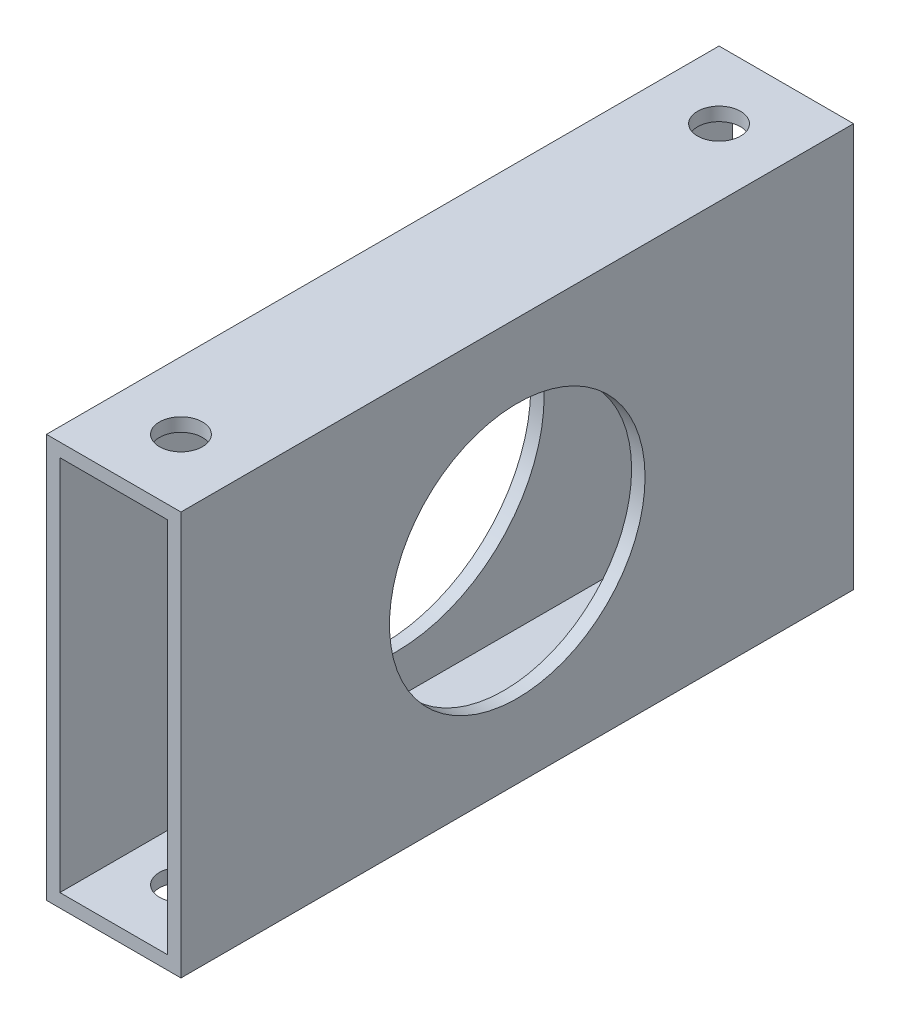
ISO-10303-21;
HEADER;
FILE_DESCRIPTION(('STEP AP214'),'2;1');
FILE_NAME('part.step','',(''),(''),'','','');
FILE_SCHEMA(('AUTOMOTIVE_DESIGN { 1 0 10303 214 1 1 1 1 }'));
ENDSEC;
DATA;
#1=APPLICATION_CONTEXT('core data for automotive mechanical design processes');
#2=APPLICATION_PROTOCOL_DEFINITION('international standard','automotive_design',2000,#1);
#3=PRODUCT_CONTEXT('',#1,'mechanical');
#4=PRODUCT('Part','Part','',(#3));
#5=PRODUCT_RELATED_PRODUCT_CATEGORY('part','',(#4));
#6=PRODUCT_DEFINITION_FORMATION('','',#4);
#7=PRODUCT_DEFINITION_CONTEXT('part definition',#1,'design');
#8=PRODUCT_DEFINITION('design','',#6,#7);
#9=PRODUCT_DEFINITION_SHAPE('','',#8);
#10=(LENGTH_UNIT() NAMED_UNIT(*) SI_UNIT(.MILLI.,.METRE.));
#11=(NAMED_UNIT(*) PLANE_ANGLE_UNIT() SI_UNIT($,.RADIAN.));
#12=(NAMED_UNIT(*) SI_UNIT($,.STERADIAN.) SOLID_ANGLE_UNIT());
#13=UNCERTAINTY_MEASURE_WITH_UNIT(LENGTH_MEASURE(1.E-05),#10,'distance_accuracy_value','');
#14=(GEOMETRIC_REPRESENTATION_CONTEXT(3) GLOBAL_UNCERTAINTY_ASSIGNED_CONTEXT((#13)) GLOBAL_UNIT_ASSIGNED_CONTEXT((#10,
#11,#12)) REPRESENTATION_CONTEXT('',''));
#15=CARTESIAN_POINT('',(0.,0.,0.));
#16=DIRECTION('',(0.,0.,1.));
#17=DIRECTION('',(1.,0.,0.));
#18=AXIS2_PLACEMENT_3D('',#15,#16,#17);
#19=CARTESIAN_POINT('',(0.,0.,50.));
#20=DIRECTION('',(0.,0.,1.));
#21=DIRECTION('',(1.,0.,0.));
#22=AXIS2_PLACEMENT_3D('',#19,#20,#21);
#23=PLANE('',#22);
#24=DIRECTION('',(0.,1.,0.));
#25=VECTOR('',#24,1.);
#26=CARTESIAN_POINT('',(5.,-15.,50.));
#27=LINE('',#26,#25);
#28=CARTESIAN_POINT('',(5.,-15.,50.));
#29=VERTEX_POINT('',#28);
#30=CARTESIAN_POINT('',(5.,15.,50.));
#31=VERTEX_POINT('',#30);
#32=EDGE_CURVE('E164',#29,#31,#27,.T.);
#33=ORIENTED_EDGE('',*,*,#32,.T.);
#34=DIRECTION('',(-1.,0.,0.));
#35=VECTOR('',#34,1.);
#36=CARTESIAN_POINT('',(-5.,15.,50.));
#37=LINE('',#36,#35);
#38=CARTESIAN_POINT('',(-5.,15.,50.));
#39=VERTEX_POINT('',#38);
#40=EDGE_CURVE('E167',#31,#39,#37,.T.);
#41=ORIENTED_EDGE('',*,*,#40,.T.);
#42=DIRECTION('',(0.,-1.,0.));
#43=VECTOR('',#42,1.);
#44=CARTESIAN_POINT('',(-5.,-15.,50.));
#45=LINE('',#44,#43);
#46=CARTESIAN_POINT('',(-5.,-15.,50.));
#47=VERTEX_POINT('',#46);
#48=EDGE_CURVE('E170',#39,#47,#45,.T.);
#49=ORIENTED_EDGE('',*,*,#48,.T.);
#50=DIRECTION('',(1.,0.,0.));
#51=VECTOR('',#50,1.);
#52=CARTESIAN_POINT('',(-5.,-15.,50.));
#53=LINE('',#52,#51);
#54=EDGE_CURVE('E172',#47,#29,#53,.T.);
#55=ORIENTED_EDGE('',*,*,#54,.T.);
#56=EDGE_LOOP('',(#33,#41,#49,#55));
#57=FACE_BOUND('',#56,.T.);
#58=DIRECTION('',(-1.,0.,0.));
#59=VECTOR('',#58,1.);
#60=CARTESIAN_POINT('',(0.,14.,50.));
#61=LINE('',#60,#59);
#62=CARTESIAN_POINT('',(4.,14.,50.));
#63=VERTEX_POINT('',#62);
#64=CARTESIAN_POINT('',(-4.,14.,50.));
#65=VERTEX_POINT('',#64);
#66=EDGE_CURVE('E134',#63,#65,#61,.T.);
#67=ORIENTED_EDGE('',*,*,#66,.F.);
#68=DIRECTION('',(0.,1.,0.));
#69=VECTOR('',#68,1.);
#70=CARTESIAN_POINT('',(4.,0.,50.));
#71=LINE('',#70,#69);
#72=CARTESIAN_POINT('',(4.,-14.,50.));
#73=VERTEX_POINT('',#72);
#74=EDGE_CURVE('E126',#73,#63,#71,.T.);
#75=ORIENTED_EDGE('',*,*,#74,.F.);
#76=DIRECTION('',(1.,0.,0.));
#77=VECTOR('',#76,1.);
#78=CARTESIAN_POINT('',(0.,-14.,50.));
#79=LINE('',#78,#77);
#80=CARTESIAN_POINT('',(-4.,-14.,50.));
#81=VERTEX_POINT('',#80);
#82=EDGE_CURVE('E148',#81,#73,#79,.T.);
#83=ORIENTED_EDGE('',*,*,#82,.F.);
#84=DIRECTION('',(0.,-1.,0.));
#85=VECTOR('',#84,1.);
#86=CARTESIAN_POINT('',(-4.,0.,50.));
#87=LINE('',#86,#85);
#88=EDGE_CURVE('E146',#65,#81,#87,.T.);
#89=ORIENTED_EDGE('',*,*,#88,.F.);
#90=EDGE_LOOP('',(#67,#75,#83,#89));
#91=FACE_BOUND('',#90,.T.);
#92=ADVANCED_FACE('F59',(#57,#91),#23,.T.);
#93=CARTESIAN_POINT('',(0.,0.,0.));
#94=DIRECTION('',(0.,0.,1.));
#95=DIRECTION('',(1.,0.,0.));
#96=AXIS2_PLACEMENT_3D('',#93,#94,#95);
#97=PLANE('',#96);
#98=DIRECTION('',(0.,1.,0.));
#99=VECTOR('',#98,1.);
#100=CARTESIAN_POINT('',(5.,-15.,0.));
#101=LINE('',#100,#99);
#102=CARTESIAN_POINT('',(5.,-15.,0.));
#103=VERTEX_POINT('',#102);
#104=CARTESIAN_POINT('',(5.,15.,0.));
#105=VERTEX_POINT('',#104);
#106=EDGE_CURVE('E142',#103,#105,#101,.T.);
#107=ORIENTED_EDGE('',*,*,#106,.F.);
#108=DIRECTION('',(1.,0.,0.));
#109=VECTOR('',#108,1.);
#110=CARTESIAN_POINT('',(-5.,-15.,0.));
#111=LINE('',#110,#109);
#112=CARTESIAN_POINT('',(-5.,-15.,0.));
#113=VERTEX_POINT('',#112);
#114=EDGE_CURVE('E168',#113,#103,#111,.T.);
#115=ORIENTED_EDGE('',*,*,#114,.F.);
#116=DIRECTION('',(0.,-1.,0.));
#117=VECTOR('',#116,1.);
#118=CARTESIAN_POINT('',(-5.,-15.,0.));
#119=LINE('',#118,#117);
#120=CARTESIAN_POINT('',(-5.,15.,0.));
#121=VERTEX_POINT('',#120);
#122=EDGE_CURVE('E179',#121,#113,#119,.T.);
#123=ORIENTED_EDGE('',*,*,#122,.F.);
#124=DIRECTION('',(-1.,0.,0.));
#125=VECTOR('',#124,1.);
#126=CARTESIAN_POINT('',(-5.,15.,0.));
#127=LINE('',#126,#125);
#128=EDGE_CURVE('E177',#105,#121,#127,.T.);
#129=ORIENTED_EDGE('',*,*,#128,.F.);
#130=EDGE_LOOP('',(#107,#115,#123,#129));
#131=FACE_BOUND('',#130,.T.);
#132=DIRECTION('',(0.,1.,0.));
#133=VECTOR('',#132,1.);
#134=CARTESIAN_POINT('',(4.,0.,0.));
#135=LINE('',#134,#133);
#136=CARTESIAN_POINT('',(4.,-14.,0.));
#137=VERTEX_POINT('',#136);
#138=CARTESIAN_POINT('',(4.,14.,0.));
#139=VERTEX_POINT('',#138);
#140=EDGE_CURVE('E84',#137,#139,#135,.T.);
#141=ORIENTED_EDGE('',*,*,#140,.T.);
#142=DIRECTION('',(-1.,0.,0.));
#143=VECTOR('',#142,1.);
#144=CARTESIAN_POINT('',(0.,14.,0.));
#145=LINE('',#144,#143);
#146=CARTESIAN_POINT('',(-4.,14.,0.));
#147=VERTEX_POINT('',#146);
#148=EDGE_CURVE('E141',#139,#147,#145,.T.);
#149=ORIENTED_EDGE('',*,*,#148,.T.);
#150=DIRECTION('',(0.,-1.,0.));
#151=VECTOR('',#150,1.);
#152=CARTESIAN_POINT('',(-4.,0.,0.));
#153=LINE('',#152,#151);
#154=CARTESIAN_POINT('',(-4.,-14.,0.));
#155=VERTEX_POINT('',#154);
#156=EDGE_CURVE('E156',#147,#155,#153,.T.);
#157=ORIENTED_EDGE('',*,*,#156,.T.);
#158=DIRECTION('',(1.,0.,0.));
#159=VECTOR('',#158,1.);
#160=CARTESIAN_POINT('',(0.,-14.,0.));
#161=LINE('',#160,#159);
#162=EDGE_CURVE('E135',#155,#137,#161,.T.);
#163=ORIENTED_EDGE('',*,*,#162,.T.);
#164=EDGE_LOOP('',(#141,#149,#157,#163));
#165=FACE_BOUND('',#164,.T.);
#166=ADVANCED_FACE('F229',(#131,#165),#97,.F.);
#167=CARTESIAN_POINT('',(5.,-15.,50.));
#168=DIRECTION('',(-1.,0.,0.));
#169=DIRECTION('',(0.,0.,1.));
#170=AXIS2_PLACEMENT_3D('',#167,#168,#169);
#171=PLANE('',#170);
#172=CARTESIAN_POINT('',(5.,0.,25.));
#173=DIRECTION('',(1.,0.,0.));
#174=DIRECTION('',(0.,0.,-1.));
#175=AXIS2_PLACEMENT_3D('',#172,#173,#174);
#176=CIRCLE('',#175,9.5);
#177=CARTESIAN_POINT('',(5.,0.,15.5));
#178=VERTEX_POINT('',#177);
#179=EDGE_CURVE('E372',#178,#178,#176,.T.);
#180=ORIENTED_EDGE('',*,*,#179,.F.);
#181=EDGE_LOOP('',(#180));
#182=FACE_BOUND('',#181,.T.);
#183=ORIENTED_EDGE('',*,*,#106,.T.);
#184=DIRECTION('',(0.,0.,-1.));
#185=VECTOR('',#184,1.);
#186=CARTESIAN_POINT('',(5.,15.,50.));
#187=LINE('',#186,#185);
#188=EDGE_CURVE('E12',#31,#105,#187,.T.);
#189=ORIENTED_EDGE('',*,*,#188,.F.);
#190=ORIENTED_EDGE('',*,*,#32,.F.);
#191=DIRECTION('',(0.,0.,-1.));
#192=VECTOR('',#191,1.);
#193=CARTESIAN_POINT('',(5.,-15.,50.));
#194=LINE('',#193,#192);
#195=EDGE_CURVE('E174',#29,#103,#194,.T.);
#196=ORIENTED_EDGE('',*,*,#195,.T.);
#197=EDGE_LOOP('',(#183,#189,#190,#196));
#198=FACE_BOUND('',#197,.T.);
#199=ADVANCED_FACE('F61',(#182,#198),#171,.F.);
#200=CARTESIAN_POINT('',(-5.,15.,50.));
#201=DIRECTION('',(0.,-1.,0.));
#202=DIRECTION('',(0.,0.,-1.));
#203=AXIS2_PLACEMENT_3D('',#200,#201,#202);
#204=PLANE('',#203);
#205=CARTESIAN_POINT('',(0.,15.,5.));
#206=DIRECTION('',(0.,1.,0.));
#207=DIRECTION('',(0.,0.,1.));
#208=AXIS2_PLACEMENT_3D('',#205,#206,#207);
#209=CIRCLE('',#208,1.6);
#210=CARTESIAN_POINT('',(0.,15.,6.6));
#211=VERTEX_POINT('',#210);
#212=EDGE_CURVE('E197',#211,#211,#209,.T.);
#213=ORIENTED_EDGE('',*,*,#212,.F.);
#214=EDGE_LOOP('',(#213));
#215=FACE_BOUND('',#214,.T.);
#216=CARTESIAN_POINT('',(0.,15.,45.));
#217=DIRECTION('',(0.,1.,0.));
#218=DIRECTION('',(0.,0.,-1.));
#219=AXIS2_PLACEMENT_3D('',#216,#217,#218);
#220=CIRCLE('',#219,1.6);
#221=CARTESIAN_POINT('',(0.,15.,43.4));
#222=VERTEX_POINT('',#221);
#223=EDGE_CURVE('E210',#222,#222,#220,.T.);
#224=ORIENTED_EDGE('',*,*,#223,.F.);
#225=EDGE_LOOP('',(#224));
#226=FACE_BOUND('',#225,.T.);
#227=ORIENTED_EDGE('',*,*,#128,.T.);
#228=DIRECTION('',(0.,0.,-1.));
#229=VECTOR('',#228,1.);
#230=CARTESIAN_POINT('',(-5.,15.,50.));
#231=LINE('',#230,#229);
#232=EDGE_CURVE('E68',#39,#121,#231,.T.);
#233=ORIENTED_EDGE('',*,*,#232,.F.);
#234=ORIENTED_EDGE('',*,*,#40,.F.);
#235=ORIENTED_EDGE('',*,*,#188,.T.);
#236=EDGE_LOOP('',(#227,#233,#234,#235));
#237=FACE_BOUND('',#236,.T.);
#238=ADVANCED_FACE('F255',(#215,#226,#237),#204,.F.);
#239=CARTESIAN_POINT('',(-5.,-15.,50.));
#240=DIRECTION('',(1.,0.,0.));
#241=DIRECTION('',(0.,0.,-1.));
#242=AXIS2_PLACEMENT_3D('',#239,#240,#241);
#243=PLANE('',#242);
#244=CARTESIAN_POINT('',(-5.,0.,25.));
#245=DIRECTION('',(-1.,0.,0.));
#246=DIRECTION('',(0.,0.,1.));
#247=AXIS2_PLACEMENT_3D('',#244,#245,#246);
#248=CIRCLE('',#247,11.);
#249=CARTESIAN_POINT('',(-5.,0.,36.));
#250=VERTEX_POINT('',#249);
#251=EDGE_CURVE('E371',#250,#250,#248,.T.);
#252=ORIENTED_EDGE('',*,*,#251,.F.);
#253=EDGE_LOOP('',(#252));
#254=FACE_BOUND('',#253,.T.);
#255=ORIENTED_EDGE('',*,*,#122,.T.);
#256=DIRECTION('',(0.,0.,-1.));
#257=VECTOR('',#256,1.);
#258=CARTESIAN_POINT('',(-5.,-15.,50.));
#259=LINE('',#258,#257);
#260=EDGE_CURVE('E184',#47,#113,#259,.T.);
#261=ORIENTED_EDGE('',*,*,#260,.F.);
#262=ORIENTED_EDGE('',*,*,#48,.F.);
#263=ORIENTED_EDGE('',*,*,#232,.T.);
#264=EDGE_LOOP('',(#255,#261,#262,#263));
#265=FACE_BOUND('',#264,.T.);
#266=ADVANCED_FACE('F253',(#254,#265),#243,.F.);
#267=CARTESIAN_POINT('',(-5.,-15.,50.));
#268=DIRECTION('',(0.,1.,0.));
#269=DIRECTION('',(0.,0.,1.));
#270=AXIS2_PLACEMENT_3D('',#267,#268,#269);
#271=PLANE('',#270);
#272=CARTESIAN_POINT('',(0.,-15.,5.));
#273=DIRECTION('',(0.,1.,0.));
#274=DIRECTION('',(0.,0.,1.));
#275=AXIS2_PLACEMENT_3D('',#272,#273,#274);
#276=CIRCLE('',#275,1.6);
#277=CARTESIAN_POINT('',(0.,-15.,6.6));
#278=VERTEX_POINT('',#277);
#279=EDGE_CURVE('E191',#278,#278,#276,.T.);
#280=ORIENTED_EDGE('',*,*,#279,.T.);
#281=EDGE_LOOP('',(#280));
#282=FACE_BOUND('',#281,.T.);
#283=CARTESIAN_POINT('',(0.,-15.,45.));
#284=DIRECTION('',(0.,1.,0.));
#285=DIRECTION('',(0.,0.,-1.));
#286=AXIS2_PLACEMENT_3D('',#283,#284,#285);
#287=CIRCLE('',#286,1.6);
#288=CARTESIAN_POINT('',(0.,-15.,43.4));
#289=VERTEX_POINT('',#288);
#290=EDGE_CURVE('E202',#289,#289,#287,.T.);
#291=ORIENTED_EDGE('',*,*,#290,.T.);
#292=EDGE_LOOP('',(#291));
#293=FACE_BOUND('',#292,.T.);
#294=ORIENTED_EDGE('',*,*,#114,.T.);
#295=ORIENTED_EDGE('',*,*,#195,.F.);
#296=ORIENTED_EDGE('',*,*,#54,.F.);
#297=ORIENTED_EDGE('',*,*,#260,.T.);
#298=EDGE_LOOP('',(#294,#295,#296,#297));
#299=FACE_BOUND('',#298,.T.);
#300=ADVANCED_FACE('F250',(#282,#293,#299),#271,.F.);
#301=CARTESIAN_POINT('',(4.,0.,50.));
#302=DIRECTION('',(-1.,0.,0.));
#303=DIRECTION('',(0.,0.,1.));
#304=AXIS2_PLACEMENT_3D('',#301,#302,#303);
#305=PLANE('',#304);
#306=CARTESIAN_POINT('',(4.,0.,25.));
#307=DIRECTION('',(-1.,0.,0.));
#308=DIRECTION('',(0.,0.,1.));
#309=AXIS2_PLACEMENT_3D('',#306,#307,#308);
#310=CIRCLE('',#309,9.5);
#311=CARTESIAN_POINT('',(4.,0.,34.5));
#312=VERTEX_POINT('',#311);
#313=EDGE_CURVE('E205',#312,#312,#310,.T.);
#314=ORIENTED_EDGE('',*,*,#313,.F.);
#315=EDGE_LOOP('',(#314));
#316=FACE_BOUND('',#315,.T.);
#317=ORIENTED_EDGE('',*,*,#140,.F.);
#318=DIRECTION('',(0.,0.,-1.));
#319=VECTOR('',#318,1.);
#320=CARTESIAN_POINT('',(4.,-14.,50.));
#321=LINE('',#320,#319);
#322=EDGE_CURVE('E130',#73,#137,#321,.T.);
#323=ORIENTED_EDGE('',*,*,#322,.F.);
#324=ORIENTED_EDGE('',*,*,#74,.T.);
#325=DIRECTION('',(0.,0.,-1.));
#326=VECTOR('',#325,1.);
#327=CARTESIAN_POINT('',(4.,14.,50.));
#328=LINE('',#327,#326);
#329=EDGE_CURVE('E129',#63,#139,#328,.T.);
#330=ORIENTED_EDGE('',*,*,#329,.T.);
#331=EDGE_LOOP('',(#317,#323,#324,#330));
#332=FACE_BOUND('',#331,.T.);
#333=ADVANCED_FACE('F128',(#316,#332),#305,.T.);
#334=CARTESIAN_POINT('',(0.,14.,50.));
#335=DIRECTION('',(0.,-1.,0.));
#336=DIRECTION('',(0.,0.,-1.));
#337=AXIS2_PLACEMENT_3D('',#334,#335,#336);
#338=PLANE('',#337);
#339=CARTESIAN_POINT('',(0.,14.,5.));
#340=DIRECTION('',(0.,-1.,0.));
#341=DIRECTION('',(0.,0.,-1.));
#342=AXIS2_PLACEMENT_3D('',#339,#340,#341);
#343=CIRCLE('',#342,1.6);
#344=CARTESIAN_POINT('',(0.,14.,3.4));
#345=VERTEX_POINT('',#344);
#346=EDGE_CURVE('E154',#345,#345,#343,.T.);
#347=ORIENTED_EDGE('',*,*,#346,.F.);
#348=EDGE_LOOP('',(#347));
#349=FACE_BOUND('',#348,.T.);
#350=CARTESIAN_POINT('',(0.,14.,45.));
#351=DIRECTION('',(0.,-1.,0.));
#352=DIRECTION('',(0.,0.,-1.));
#353=AXIS2_PLACEMENT_3D('',#350,#351,#352);
#354=CIRCLE('',#353,1.6);
#355=CARTESIAN_POINT('',(0.,14.,43.4));
#356=VERTEX_POINT('',#355);
#357=EDGE_CURVE('E190',#356,#356,#354,.T.);
#358=ORIENTED_EDGE('',*,*,#357,.F.);
#359=EDGE_LOOP('',(#358));
#360=FACE_BOUND('',#359,.T.);
#361=ORIENTED_EDGE('',*,*,#148,.F.);
#362=ORIENTED_EDGE('',*,*,#329,.F.);
#363=ORIENTED_EDGE('',*,*,#66,.T.);
#364=DIRECTION('',(0.,0.,-1.));
#365=VECTOR('',#364,1.);
#366=CARTESIAN_POINT('',(-4.,14.,50.));
#367=LINE('',#366,#365);
#368=EDGE_CURVE('E143',#65,#147,#367,.T.);
#369=ORIENTED_EDGE('',*,*,#368,.T.);
#370=EDGE_LOOP('',(#361,#362,#363,#369));
#371=FACE_BOUND('',#370,.T.);
#372=ADVANCED_FACE('F138',(#349,#360,#371),#338,.T.);
#373=CARTESIAN_POINT('',(-4.,0.,50.));
#374=DIRECTION('',(1.,0.,0.));
#375=DIRECTION('',(0.,0.,-1.));
#376=AXIS2_PLACEMENT_3D('',#373,#374,#375);
#377=PLANE('',#376);
#378=CARTESIAN_POINT('',(-4.,0.,25.));
#379=DIRECTION('',(1.,0.,0.));
#380=DIRECTION('',(0.,0.,-1.));
#381=AXIS2_PLACEMENT_3D('',#378,#379,#380);
#382=CIRCLE('',#381,11.);
#383=CARTESIAN_POINT('',(-4.,0.,14.));
#384=VERTEX_POINT('',#383);
#385=EDGE_CURVE('E368',#384,#384,#382,.F.);
#386=ORIENTED_EDGE('',*,*,#385,.T.);
#387=EDGE_LOOP('',(#386));
#388=FACE_BOUND('',#387,.T.);
#389=ORIENTED_EDGE('',*,*,#156,.F.);
#390=ORIENTED_EDGE('',*,*,#368,.F.);
#391=ORIENTED_EDGE('',*,*,#88,.T.);
#392=DIRECTION('',(0.,0.,-1.));
#393=VECTOR('',#392,1.);
#394=CARTESIAN_POINT('',(-4.,-14.,50.));
#395=LINE('',#394,#393);
#396=EDGE_CURVE('E76',#81,#155,#395,.T.);
#397=ORIENTED_EDGE('',*,*,#396,.T.);
#398=EDGE_LOOP('',(#389,#390,#391,#397));
#399=FACE_BOUND('',#398,.T.);
#400=ADVANCED_FACE('F225',(#388,#399),#377,.T.);
#401=CARTESIAN_POINT('',(0.,-14.,50.));
#402=DIRECTION('',(0.,1.,0.));
#403=DIRECTION('',(0.,0.,1.));
#404=AXIS2_PLACEMENT_3D('',#401,#402,#403);
#405=PLANE('',#404);
#406=CARTESIAN_POINT('',(0.,-14.,5.));
#407=DIRECTION('',(0.,1.,0.));
#408=DIRECTION('',(0.,0.,1.));
#409=AXIS2_PLACEMENT_3D('',#406,#407,#408);
#410=CIRCLE('',#409,1.6);
#411=CARTESIAN_POINT('',(0.,-14.,6.6));
#412=VERTEX_POINT('',#411);
#413=EDGE_CURVE('E63',#412,#412,#410,.T.);
#414=ORIENTED_EDGE('',*,*,#413,.F.);
#415=EDGE_LOOP('',(#414));
#416=FACE_BOUND('',#415,.T.);
#417=CARTESIAN_POINT('',(0.,-14.,45.));
#418=DIRECTION('',(0.,1.,0.));
#419=DIRECTION('',(0.,0.,1.));
#420=AXIS2_PLACEMENT_3D('',#417,#418,#419);
#421=CIRCLE('',#420,1.6);
#422=CARTESIAN_POINT('',(0.,-14.,46.6));
#423=VERTEX_POINT('',#422);
#424=EDGE_CURVE('E188',#423,#423,#421,.T.);
#425=ORIENTED_EDGE('',*,*,#424,.F.);
#426=EDGE_LOOP('',(#425));
#427=FACE_BOUND('',#426,.T.);
#428=ORIENTED_EDGE('',*,*,#162,.F.);
#429=ORIENTED_EDGE('',*,*,#396,.F.);
#430=ORIENTED_EDGE('',*,*,#82,.T.);
#431=ORIENTED_EDGE('',*,*,#322,.T.);
#432=EDGE_LOOP('',(#428,#429,#430,#431));
#433=FACE_BOUND('',#432,.T.);
#434=ADVANCED_FACE('F221',(#416,#427,#433),#405,.T.);
#435=CARTESIAN_POINT('',(0.,-15.,45.));
#436=DIRECTION('',(0.,1.,0.));
#437=DIRECTION('',(0.,0.,1.));
#438=AXIS2_PLACEMENT_3D('',#435,#436,#437);
#439=CYLINDRICAL_SURFACE('',#438,1.6);
#440=ORIENTED_EDGE('',*,*,#424,.T.);
#441=EDGE_LOOP('',(#440));
#442=FACE_BOUND('',#441,.T.);
#443=ORIENTED_EDGE('',*,*,#290,.F.);
#444=EDGE_LOOP('',(#443));
#445=FACE_BOUND('',#444,.T.);
#446=ADVANCED_FACE('F224',(#442,#445),#439,.F.);
#447=CARTESIAN_POINT('',(0.,-15.,5.));
#448=DIRECTION('',(0.,1.,0.));
#449=DIRECTION('',(0.,0.,1.));
#450=AXIS2_PLACEMENT_3D('',#447,#448,#449);
#451=CYLINDRICAL_SURFACE('',#450,1.6);
#452=ORIENTED_EDGE('',*,*,#413,.T.);
#453=EDGE_LOOP('',(#452));
#454=FACE_BOUND('',#453,.T.);
#455=ORIENTED_EDGE('',*,*,#279,.F.);
#456=EDGE_LOOP('',(#455));
#457=FACE_BOUND('',#456,.T.);
#458=ADVANCED_FACE('F218',(#454,#457),#451,.F.);
#459=ORIENTED_EDGE('',*,*,#357,.T.);
#460=EDGE_LOOP('',(#459));
#461=FACE_BOUND('',#460,.T.);
#462=ORIENTED_EDGE('',*,*,#223,.T.);
#463=EDGE_LOOP('',(#462));
#464=FACE_BOUND('',#463,.T.);
#465=ADVANCED_FACE('F281',(#461,#464),#439,.F.);
#466=ORIENTED_EDGE('',*,*,#346,.T.);
#467=EDGE_LOOP('',(#466));
#468=FACE_BOUND('',#467,.T.);
#469=ORIENTED_EDGE('',*,*,#212,.T.);
#470=EDGE_LOOP('',(#469));
#471=FACE_BOUND('',#470,.T.);
#472=ADVANCED_FACE('F283',(#468,#471),#451,.F.);
#473=CARTESIAN_POINT('',(-5.,0.,25.));
#474=DIRECTION('',(1.,0.,0.));
#475=DIRECTION('',(0.,0.,-1.));
#476=AXIS2_PLACEMENT_3D('',#473,#474,#475);
#477=CYLINDRICAL_SURFACE('',#476,9.5);
#478=ORIENTED_EDGE('',*,*,#313,.T.);
#479=EDGE_LOOP('',(#478));
#480=FACE_BOUND('',#479,.T.);
#481=ORIENTED_EDGE('',*,*,#179,.T.);
#482=EDGE_LOOP('',(#481));
#483=FACE_BOUND('',#482,.T.);
#484=ADVANCED_FACE('F290',(#480,#483),#477,.F.);
#485=CARTESIAN_POINT('',(5.001,0.,25.));
#486=DIRECTION('',(-1.,0.,0.));
#487=DIRECTION('',(0.,0.,1.));
#488=AXIS2_PLACEMENT_3D('',#485,#486,#487);
#489=CYLINDRICAL_SURFACE('',#488,11.);
#490=ORIENTED_EDGE('',*,*,#385,.F.);
#491=EDGE_LOOP('',(#490));
#492=FACE_BOUND('',#491,.T.);
#493=ORIENTED_EDGE('',*,*,#251,.T.);
#494=EDGE_LOOP('',(#493));
#495=FACE_BOUND('',#494,.T.);
#496=ADVANCED_FACE('F341',(#492,#495),#489,.F.);
#497=CLOSED_SHELL('',(#92,#166,#199,#238,#266,#300,#333,#372,#400,#434,#446,#458,#465,#472,#484,#496));
#498=MANIFOLD_SOLID_BREP('B2',#497);
#499=ADVANCED_BREP_SHAPE_REPRESENTATION('',(#18,#498),#14);
#500=SHAPE_DEFINITION_REPRESENTATION(#9,#499);
ENDSEC;
END-ISO-10303-21;
